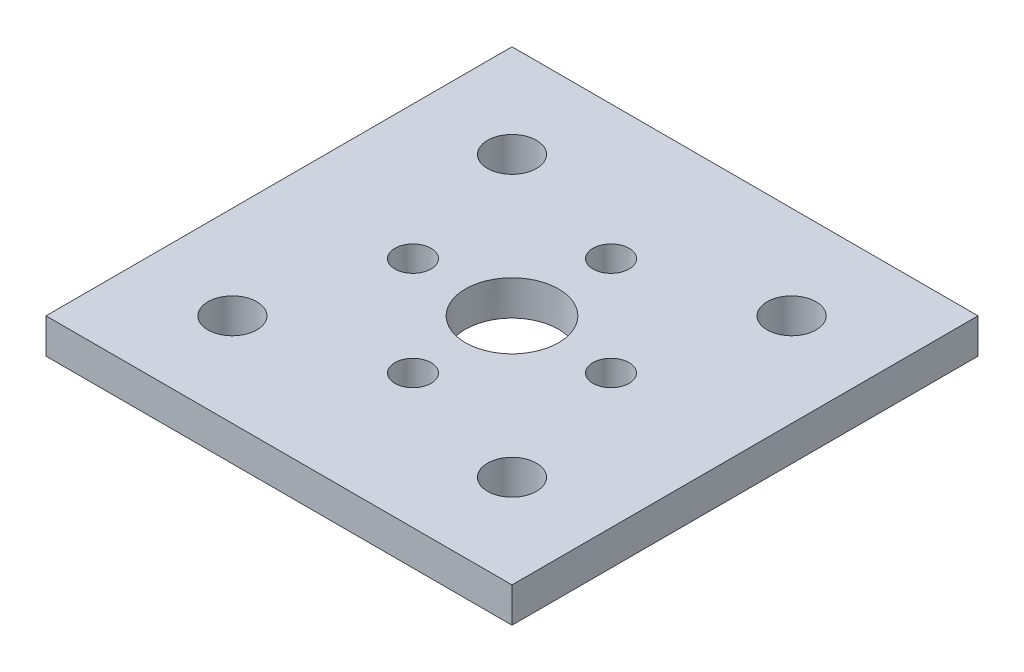
ISO-10303-21;
HEADER;
FILE_DESCRIPTION(('STEP AP214'),'2;1');
FILE_NAME('part.step','',(''),(''),'','','');
FILE_SCHEMA(('AUTOMOTIVE_DESIGN { 1 0 10303 214 1 1 1 1 }'));
ENDSEC;
DATA;
#1=APPLICATION_CONTEXT('core data for automotive mechanical design processes');
#2=APPLICATION_PROTOCOL_DEFINITION('international standard','automotive_design',2000,#1);
#3=PRODUCT_CONTEXT('',#1,'mechanical');
#4=PRODUCT('Part','Part','',(#3));
#5=PRODUCT_RELATED_PRODUCT_CATEGORY('part','',(#4));
#6=PRODUCT_DEFINITION_FORMATION('','',#4);
#7=PRODUCT_DEFINITION_CONTEXT('part definition',#1,'design');
#8=PRODUCT_DEFINITION('design','',#6,#7);
#9=PRODUCT_DEFINITION_SHAPE('','',#8);
#10=(LENGTH_UNIT() NAMED_UNIT(*) SI_UNIT(.MILLI.,.METRE.));
#11=(NAMED_UNIT(*) PLANE_ANGLE_UNIT() SI_UNIT($,.RADIAN.));
#12=(NAMED_UNIT(*) SI_UNIT($,.STERADIAN.) SOLID_ANGLE_UNIT());
#13=UNCERTAINTY_MEASURE_WITH_UNIT(LENGTH_MEASURE(1.E-05),#10,'distance_accuracy_value','');
#14=(GEOMETRIC_REPRESENTATION_CONTEXT(3) GLOBAL_UNCERTAINTY_ASSIGNED_CONTEXT((#13)) GLOBAL_UNIT_ASSIGNED_CONTEXT((#10,
#11,#12)) REPRESENTATION_CONTEXT('',''));
#15=CARTESIAN_POINT('',(0.,0.,0.));
#16=DIRECTION('',(0.,0.,1.));
#17=DIRECTION('',(1.,0.,0.));
#18=AXIS2_PLACEMENT_3D('',#15,#16,#17);
#19=CARTESIAN_POINT('',(-20.,-3.,-20.));
#20=DIRECTION('',(0.,0.,1.));
#21=DIRECTION('',(1.,0.,0.));
#22=AXIS2_PLACEMENT_3D('',#19,#20,#21);
#23=PLANE('',#22);
#24=DIRECTION('',(0.,1.,0.));
#25=VECTOR('',#24,1.);
#26=CARTESIAN_POINT('',(-20.,-3.,-20.));
#27=LINE('',#26,#25);
#28=CARTESIAN_POINT('',(-20.,-3.,-20.));
#29=VERTEX_POINT('',#28);
#30=CARTESIAN_POINT('',(-20.,0.,-20.));
#31=VERTEX_POINT('',#30);
#32=EDGE_CURVE('E133',#29,#31,#27,.T.);
#33=ORIENTED_EDGE('',*,*,#32,.T.);
#34=DIRECTION('',(-1.,0.,0.));
#35=VECTOR('',#34,1.);
#36=CARTESIAN_POINT('',(-20.,0.,-20.));
#37=LINE('',#36,#35);
#38=CARTESIAN_POINT('',(20.,0.,-20.));
#39=VERTEX_POINT('',#38);
#40=EDGE_CURVE('E126',#39,#31,#37,.T.);
#41=ORIENTED_EDGE('',*,*,#40,.F.);
#42=DIRECTION('',(0.,1.,0.));
#43=VECTOR('',#42,1.);
#44=CARTESIAN_POINT('',(20.,-3.,-20.));
#45=LINE('',#44,#43);
#46=CARTESIAN_POINT('',(20.,-3.,-20.));
#47=VERTEX_POINT('',#46);
#48=EDGE_CURVE('E12',#47,#39,#45,.T.);
#49=ORIENTED_EDGE('',*,*,#48,.F.);
#50=DIRECTION('',(1.,0.,0.));
#51=VECTOR('',#50,1.);
#52=CARTESIAN_POINT('',(-20.,-3.,-20.));
#53=LINE('',#52,#51);
#54=EDGE_CURVE('E187',#29,#47,#53,.T.);
#55=ORIENTED_EDGE('',*,*,#54,.F.);
#56=EDGE_LOOP('',(#33,#41,#49,#55));
#57=FACE_BOUND('',#56,.T.);
#58=ADVANCED_FACE('F111',(#57),#23,.F.);
#59=CARTESIAN_POINT('',(-20.,-3.,20.));
#60=DIRECTION('',(0.,0.,1.));
#61=DIRECTION('',(1.,0.,0.));
#62=AXIS2_PLACEMENT_3D('',#59,#60,#61);
#63=PLANE('',#62);
#64=DIRECTION('',(1.,0.,0.));
#65=VECTOR('',#64,1.);
#66=CARTESIAN_POINT('',(-20.,0.,20.));
#67=LINE('',#66,#65);
#68=CARTESIAN_POINT('',(-20.,0.,20.));
#69=VERTEX_POINT('',#68);
#70=CARTESIAN_POINT('',(20.,0.,20.));
#71=VERTEX_POINT('',#70);
#72=EDGE_CURVE('E154',#69,#71,#67,.T.);
#73=ORIENTED_EDGE('',*,*,#72,.F.);
#74=DIRECTION('',(0.,1.,0.));
#75=VECTOR('',#74,1.);
#76=CARTESIAN_POINT('',(-20.,-3.,20.));
#77=LINE('',#76,#75);
#78=CARTESIAN_POINT('',(-20.,-3.,20.));
#79=VERTEX_POINT('',#78);
#80=EDGE_CURVE('E164',#79,#69,#77,.T.);
#81=ORIENTED_EDGE('',*,*,#80,.F.);
#82=DIRECTION('',(1.,0.,0.));
#83=VECTOR('',#82,1.);
#84=CARTESIAN_POINT('',(-20.,-3.,20.));
#85=LINE('',#84,#83);
#86=CARTESIAN_POINT('',(20.,-3.,20.));
#87=VERTEX_POINT('',#86);
#88=EDGE_CURVE('E181',#79,#87,#85,.T.);
#89=ORIENTED_EDGE('',*,*,#88,.T.);
#90=DIRECTION('',(0.,1.,0.));
#91=VECTOR('',#90,1.);
#92=CARTESIAN_POINT('',(20.,-3.,20.));
#93=LINE('',#92,#91);
#94=EDGE_CURVE('E119',#87,#71,#93,.T.);
#95=ORIENTED_EDGE('',*,*,#94,.T.);
#96=EDGE_LOOP('',(#73,#81,#89,#95));
#97=FACE_BOUND('',#96,.T.);
#98=ADVANCED_FACE('F162',(#97),#63,.T.);
#99=CARTESIAN_POINT('',(20.,-3.,-20.));
#100=DIRECTION('',(-1.,0.,0.));
#101=DIRECTION('',(0.,0.,1.));
#102=AXIS2_PLACEMENT_3D('',#99,#100,#101);
#103=PLANE('',#102);
#104=ORIENTED_EDGE('',*,*,#48,.T.);
#105=DIRECTION('',(0.,0.,-1.));
#106=VECTOR('',#105,1.);
#107=CARTESIAN_POINT('',(20.,0.,20.));
#108=LINE('',#107,#106);
#109=EDGE_CURVE('E168',#71,#39,#108,.T.);
#110=ORIENTED_EDGE('',*,*,#109,.F.);
#111=ORIENTED_EDGE('',*,*,#94,.F.);
#112=DIRECTION('',(0.,0.,1.));
#113=VECTOR('',#112,1.);
#114=CARTESIAN_POINT('',(20.,-3.,-20.));
#115=LINE('',#114,#113);
#116=EDGE_CURVE('E184',#47,#87,#115,.T.);
#117=ORIENTED_EDGE('',*,*,#116,.F.);
#118=EDGE_LOOP('',(#104,#110,#111,#117));
#119=FACE_BOUND('',#118,.T.);
#120=ADVANCED_FACE('F295',(#119),#103,.F.);
#121=CARTESIAN_POINT('',(-20.,-3.,-20.));
#122=DIRECTION('',(-1.,0.,0.));
#123=DIRECTION('',(0.,0.,1.));
#124=AXIS2_PLACEMENT_3D('',#121,#122,#123);
#125=PLANE('',#124);
#126=DIRECTION('',(0.,0.,1.));
#127=VECTOR('',#126,1.);
#128=CARTESIAN_POINT('',(-20.,0.,20.));
#129=LINE('',#128,#127);
#130=EDGE_CURVE('E150',#31,#69,#129,.T.);
#131=ORIENTED_EDGE('',*,*,#130,.F.);
#132=ORIENTED_EDGE('',*,*,#32,.F.);
#133=DIRECTION('',(0.,0.,1.));
#134=VECTOR('',#133,1.);
#135=CARTESIAN_POINT('',(-20.,-3.,-20.));
#136=LINE('',#135,#134);
#137=EDGE_CURVE('E172',#29,#79,#136,.T.);
#138=ORIENTED_EDGE('',*,*,#137,.T.);
#139=ORIENTED_EDGE('',*,*,#80,.T.);
#140=EDGE_LOOP('',(#131,#132,#138,#139));
#141=FACE_BOUND('',#140,.T.);
#142=ADVANCED_FACE('F170',(#141),#125,.T.);
#143=CARTESIAN_POINT('',(0.,0.,0.));
#144=DIRECTION('',(0.,-1.,0.));
#145=DIRECTION('',(0.,0.,-1.));
#146=AXIS2_PLACEMENT_3D('',#143,#144,#145);
#147=PLANE('',#146);
#148=CARTESIAN_POINT('',(-8.5,0.,0.));
#149=DIRECTION('',(0.,1.,0.));
#150=DIRECTION('',(0.,0.,1.));
#151=AXIS2_PLACEMENT_3D('',#148,#149,#150);
#152=CIRCLE('',#151,1.55);
#153=CARTESIAN_POINT('',(-8.5,0.,1.54999999999991));
#154=VERTEX_POINT('',#153);
#155=EDGE_CURVE('E192',#154,#154,#152,.T.);
#156=ORIENTED_EDGE('',*,*,#155,.F.);
#157=EDGE_LOOP('',(#156));
#158=FACE_BOUND('',#157,.T.);
#159=CARTESIAN_POINT('',(0.,0.,8.5));
#160=DIRECTION('',(0.,1.,0.));
#161=DIRECTION('',(0.,0.,1.));
#162=AXIS2_PLACEMENT_3D('',#159,#160,#161);
#163=CIRCLE('',#162,1.55);
#164=CARTESIAN_POINT('',(0.,0.,10.05));
#165=VERTEX_POINT('',#164);
#166=EDGE_CURVE('E200',#165,#165,#163,.T.);
#167=ORIENTED_EDGE('',*,*,#166,.F.);
#168=EDGE_LOOP('',(#167));
#169=FACE_BOUND('',#168,.T.);
#170=CARTESIAN_POINT('',(0.,0.,-8.5));
#171=DIRECTION('',(0.,1.,0.));
#172=DIRECTION('',(0.,0.,1.));
#173=AXIS2_PLACEMENT_3D('',#170,#171,#172);
#174=CIRCLE('',#173,1.55);
#175=CARTESIAN_POINT('',(0.,0.,-6.95));
#176=VERTEX_POINT('',#175);
#177=EDGE_CURVE('E208',#176,#176,#174,.T.);
#178=ORIENTED_EDGE('',*,*,#177,.F.);
#179=EDGE_LOOP('',(#178));
#180=FACE_BOUND('',#179,.T.);
#181=CARTESIAN_POINT('',(8.5,0.,0.));
#182=DIRECTION('',(0.,1.,0.));
#183=DIRECTION('',(0.,0.,1.));
#184=AXIS2_PLACEMENT_3D('',#181,#182,#183);
#185=CIRCLE('',#184,1.55);
#186=CARTESIAN_POINT('',(8.5,0.,1.55000000000003));
#187=VERTEX_POINT('',#186);
#188=EDGE_CURVE('E216',#187,#187,#185,.T.);
#189=ORIENTED_EDGE('',*,*,#188,.F.);
#190=EDGE_LOOP('',(#189));
#191=FACE_BOUND('',#190,.T.);
#192=CARTESIAN_POINT('',(0.,0.,0.));
#193=DIRECTION('',(0.,1.,0.));
#194=DIRECTION('',(0.,0.,1.));
#195=AXIS2_PLACEMENT_3D('',#192,#193,#194);
#196=CIRCLE('',#195,4.);
#197=CARTESIAN_POINT('',(0.,0.,4.));
#198=VERTEX_POINT('',#197);
#199=EDGE_CURVE('E220',#198,#198,#196,.T.);
#200=ORIENTED_EDGE('',*,*,#199,.F.);
#201=EDGE_LOOP('',(#200));
#202=FACE_BOUND('',#201,.T.);
#203=ORIENTED_EDGE('',*,*,#130,.T.);
#204=ORIENTED_EDGE('',*,*,#72,.T.);
#205=ORIENTED_EDGE('',*,*,#109,.T.);
#206=ORIENTED_EDGE('',*,*,#40,.T.);
#207=EDGE_LOOP('',(#203,#204,#205,#206));
#208=FACE_BOUND('',#207,.T.);
#209=CARTESIAN_POINT('',(-12.0000000000001,0.,-11.9999999999999));
#210=DIRECTION('',(0.,1.,0.));
#211=DIRECTION('',(0.,0.,1.));
#212=AXIS2_PLACEMENT_3D('',#209,#210,#211);
#213=CIRCLE('',#212,2.1);
#214=CARTESIAN_POINT('',(-12.0000000000001,0.,-9.89999999999988));
#215=VERTEX_POINT('',#214);
#216=EDGE_CURVE('E235',#215,#215,#213,.T.);
#217=ORIENTED_EDGE('',*,*,#216,.F.);
#218=EDGE_LOOP('',(#217));
#219=FACE_BOUND('',#218,.T.);
#220=CARTESIAN_POINT('',(11.9999999999999,0.,-12.0000000000001));
#221=DIRECTION('',(0.,1.,0.));
#222=DIRECTION('',(0.,0.,1.));
#223=AXIS2_PLACEMENT_3D('',#220,#221,#222);
#224=CIRCLE('',#223,2.1);
#225=CARTESIAN_POINT('',(11.9999999999999,0.,-9.90000000000009));
#226=VERTEX_POINT('',#225);
#227=EDGE_CURVE('E239',#226,#226,#224,.T.);
#228=ORIENTED_EDGE('',*,*,#227,.F.);
#229=EDGE_LOOP('',(#228));
#230=FACE_BOUND('',#229,.T.);
#231=CARTESIAN_POINT('',(12.,0.,12.));
#232=DIRECTION('',(0.,1.,0.));
#233=DIRECTION('',(0.,0.,1.));
#234=AXIS2_PLACEMENT_3D('',#231,#232,#233);
#235=CIRCLE('',#234,2.1);
#236=CARTESIAN_POINT('',(12.,0.,14.1));
#237=VERTEX_POINT('',#236);
#238=EDGE_CURVE('E248',#237,#237,#235,.T.);
#239=ORIENTED_EDGE('',*,*,#238,.F.);
#240=EDGE_LOOP('',(#239));
#241=FACE_BOUND('',#240,.T.);
#242=CARTESIAN_POINT('',(-12.,0.,12.));
#243=DIRECTION('',(0.,1.,0.));
#244=DIRECTION('',(0.,0.,1.));
#245=AXIS2_PLACEMENT_3D('',#242,#243,#244);
#246=CIRCLE('',#245,2.1);
#247=CARTESIAN_POINT('',(-12.,0.,14.1));
#248=VERTEX_POINT('',#247);
#249=EDGE_CURVE('E247',#248,#248,#246,.T.);
#250=ORIENTED_EDGE('',*,*,#249,.F.);
#251=EDGE_LOOP('',(#250));
#252=FACE_BOUND('',#251,.T.);
#253=ADVANCED_FACE('F152',(#158,#169,#180,#191,#202,#208,#219,#230,#241,#252),#147,.F.);
#254=CARTESIAN_POINT('',(0.,-3.,0.));
#255=DIRECTION('',(0.,-1.,0.));
#256=DIRECTION('',(0.,0.,-1.));
#257=AXIS2_PLACEMENT_3D('',#254,#255,#256);
#258=PLANE('',#257);
#259=CARTESIAN_POINT('',(0.,-3.,0.));
#260=DIRECTION('',(0.,-1.,0.));
#261=DIRECTION('',(0.,0.,-1.));
#262=AXIS2_PLACEMENT_3D('',#259,#260,#261);
#263=CIRCLE('',#262,4.);
#264=CARTESIAN_POINT('',(0.,-3.,-4.));
#265=VERTEX_POINT('',#264);
#266=EDGE_CURVE('E227',#265,#265,#263,.T.);
#267=ORIENTED_EDGE('',*,*,#266,.F.);
#268=EDGE_LOOP('',(#267));
#269=FACE_BOUND('',#268,.T.);
#270=CARTESIAN_POINT('',(8.5,-3.,0.));
#271=DIRECTION('',(0.,1.,0.));
#272=DIRECTION('',(0.,0.,1.));
#273=AXIS2_PLACEMENT_3D('',#270,#271,#272);
#274=CIRCLE('',#273,1.55);
#275=CARTESIAN_POINT('',(8.5,-3.,1.55000000000003));
#276=VERTEX_POINT('',#275);
#277=EDGE_CURVE('E212',#276,#276,#274,.T.);
#278=ORIENTED_EDGE('',*,*,#277,.T.);
#279=EDGE_LOOP('',(#278));
#280=FACE_BOUND('',#279,.T.);
#281=CARTESIAN_POINT('',(0.,-3.,-8.5));
#282=DIRECTION('',(0.,1.,0.));
#283=DIRECTION('',(0.,0.,1.));
#284=AXIS2_PLACEMENT_3D('',#281,#282,#283);
#285=CIRCLE('',#284,1.55);
#286=CARTESIAN_POINT('',(0.,-3.,-6.95));
#287=VERTEX_POINT('',#286);
#288=EDGE_CURVE('E204',#287,#287,#285,.T.);
#289=ORIENTED_EDGE('',*,*,#288,.T.);
#290=EDGE_LOOP('',(#289));
#291=FACE_BOUND('',#290,.T.);
#292=CARTESIAN_POINT('',(0.,-3.,8.5));
#293=DIRECTION('',(0.,1.,0.));
#294=DIRECTION('',(0.,0.,1.));
#295=AXIS2_PLACEMENT_3D('',#292,#293,#294);
#296=CIRCLE('',#295,1.55);
#297=CARTESIAN_POINT('',(0.,-3.,10.05));
#298=VERTEX_POINT('',#297);
#299=EDGE_CURVE('E196',#298,#298,#296,.T.);
#300=ORIENTED_EDGE('',*,*,#299,.T.);
#301=EDGE_LOOP('',(#300));
#302=FACE_BOUND('',#301,.T.);
#303=CARTESIAN_POINT('',(-8.5,-3.,0.));
#304=DIRECTION('',(0.,1.,0.));
#305=DIRECTION('',(0.,0.,1.));
#306=AXIS2_PLACEMENT_3D('',#303,#304,#305);
#307=CIRCLE('',#306,1.55);
#308=CARTESIAN_POINT('',(-8.5,-3.,1.54999999999991));
#309=VERTEX_POINT('',#308);
#310=EDGE_CURVE('E191',#309,#309,#307,.T.);
#311=ORIENTED_EDGE('',*,*,#310,.T.);
#312=EDGE_LOOP('',(#311));
#313=FACE_BOUND('',#312,.T.);
#314=ORIENTED_EDGE('',*,*,#54,.T.);
#315=ORIENTED_EDGE('',*,*,#116,.T.);
#316=ORIENTED_EDGE('',*,*,#88,.F.);
#317=ORIENTED_EDGE('',*,*,#137,.F.);
#318=EDGE_LOOP('',(#314,#315,#316,#317));
#319=FACE_BOUND('',#318,.T.);
#320=CARTESIAN_POINT('',(-12.0000000000001,-3.,-11.9999999999999));
#321=DIRECTION('',(0.,1.,0.));
#322=DIRECTION('',(0.,0.,1.));
#323=AXIS2_PLACEMENT_3D('',#320,#321,#322);
#324=CIRCLE('',#323,2.1);
#325=CARTESIAN_POINT('',(-12.0000000000001,-3.,-9.89999999999988));
#326=VERTEX_POINT('',#325);
#327=EDGE_CURVE('E158',#326,#326,#324,.T.);
#328=ORIENTED_EDGE('',*,*,#327,.T.);
#329=EDGE_LOOP('',(#328));
#330=FACE_BOUND('',#329,.T.);
#331=CARTESIAN_POINT('',(11.9999999999999,-3.,-12.0000000000001));
#332=DIRECTION('',(0.,1.,0.));
#333=DIRECTION('',(0.,0.,1.));
#334=AXIS2_PLACEMENT_3D('',#331,#332,#333);
#335=CIRCLE('',#334,2.1);
#336=CARTESIAN_POINT('',(11.9999999999999,-3.,-9.90000000000009));
#337=VERTEX_POINT('',#336);
#338=EDGE_CURVE('E252',#337,#337,#335,.T.);
#339=ORIENTED_EDGE('',*,*,#338,.T.);
#340=EDGE_LOOP('',(#339));
#341=FACE_BOUND('',#340,.T.);
#342=CARTESIAN_POINT('',(12.,-3.,12.));
#343=DIRECTION('',(0.,1.,0.));
#344=DIRECTION('',(0.,0.,1.));
#345=AXIS2_PLACEMENT_3D('',#342,#343,#344);
#346=CIRCLE('',#345,2.1);
#347=CARTESIAN_POINT('',(12.,-3.,14.1));
#348=VERTEX_POINT('',#347);
#349=EDGE_CURVE('E259',#348,#348,#346,.T.);
#350=ORIENTED_EDGE('',*,*,#349,.T.);
#351=EDGE_LOOP('',(#350));
#352=FACE_BOUND('',#351,.T.);
#353=CARTESIAN_POINT('',(-12.,-3.,12.));
#354=DIRECTION('',(0.,1.,0.));
#355=DIRECTION('',(0.,0.,1.));
#356=AXIS2_PLACEMENT_3D('',#353,#354,#355);
#357=CIRCLE('',#356,2.1);
#358=CARTESIAN_POINT('',(-12.,-3.,14.1));
#359=VERTEX_POINT('',#358);
#360=EDGE_CURVE('E243',#359,#359,#357,.T.);
#361=ORIENTED_EDGE('',*,*,#360,.T.);
#362=EDGE_LOOP('',(#361));
#363=FACE_BOUND('',#362,.T.);
#364=ADVANCED_FACE('F271',(#269,#280,#291,#302,#313,#319,#330,#341,#352,#363),#258,.T.);
#365=CARTESIAN_POINT('',(-8.5,-3.,0.));
#366=DIRECTION('',(0.,1.,0.));
#367=DIRECTION('',(0.,0.,1.));
#368=AXIS2_PLACEMENT_3D('',#365,#366,#367);
#369=CYLINDRICAL_SURFACE('',#368,1.55);
#370=ORIENTED_EDGE('',*,*,#310,.F.);
#371=EDGE_LOOP('',(#370));
#372=FACE_BOUND('',#371,.T.);
#373=ORIENTED_EDGE('',*,*,#155,.T.);
#374=EDGE_LOOP('',(#373));
#375=FACE_BOUND('',#374,.T.);
#376=ADVANCED_FACE('F309',(#372,#375),#369,.F.);
#377=CARTESIAN_POINT('',(0.,-3.,8.5));
#378=DIRECTION('',(0.,1.,0.));
#379=DIRECTION('',(0.,0.,1.));
#380=AXIS2_PLACEMENT_3D('',#377,#378,#379);
#381=CYLINDRICAL_SURFACE('',#380,1.55);
#382=ORIENTED_EDGE('',*,*,#299,.F.);
#383=EDGE_LOOP('',(#382));
#384=FACE_BOUND('',#383,.T.);
#385=ORIENTED_EDGE('',*,*,#166,.T.);
#386=EDGE_LOOP('',(#385));
#387=FACE_BOUND('',#386,.T.);
#388=ADVANCED_FACE('F313',(#384,#387),#381,.F.);
#389=CARTESIAN_POINT('',(0.,-3.,-8.5));
#390=DIRECTION('',(0.,1.,0.));
#391=DIRECTION('',(0.,0.,1.));
#392=AXIS2_PLACEMENT_3D('',#389,#390,#391);
#393=CYLINDRICAL_SURFACE('',#392,1.55);
#394=ORIENTED_EDGE('',*,*,#288,.F.);
#395=EDGE_LOOP('',(#394));
#396=FACE_BOUND('',#395,.T.);
#397=ORIENTED_EDGE('',*,*,#177,.T.);
#398=EDGE_LOOP('',(#397));
#399=FACE_BOUND('',#398,.T.);
#400=ADVANCED_FACE('F317',(#396,#399),#393,.F.);
#401=CARTESIAN_POINT('',(8.5,-3.,0.));
#402=DIRECTION('',(0.,1.,0.));
#403=DIRECTION('',(0.,0.,1.));
#404=AXIS2_PLACEMENT_3D('',#401,#402,#403);
#405=CYLINDRICAL_SURFACE('',#404,1.55);
#406=ORIENTED_EDGE('',*,*,#277,.F.);
#407=EDGE_LOOP('',(#406));
#408=FACE_BOUND('',#407,.T.);
#409=ORIENTED_EDGE('',*,*,#188,.T.);
#410=EDGE_LOOP('',(#409));
#411=FACE_BOUND('',#410,.T.);
#412=ADVANCED_FACE('F321',(#408,#411),#405,.F.);
#413=CARTESIAN_POINT('',(0.,-1.5,0.));
#414=DIRECTION('',(0.,1.,0.));
#415=DIRECTION('',(0.,0.,1.));
#416=AXIS2_PLACEMENT_3D('',#413,#414,#415);
#417=CYLINDRICAL_SURFACE('',#416,4.);
#418=ORIENTED_EDGE('',*,*,#199,.T.);
#419=EDGE_LOOP('',(#418));
#420=FACE_BOUND('',#419,.T.);
#421=ORIENTED_EDGE('',*,*,#266,.T.);
#422=EDGE_LOOP('',(#421));
#423=FACE_BOUND('',#422,.T.);
#424=ADVANCED_FACE('F325',(#420,#423),#417,.F.);
#425=CARTESIAN_POINT('',(-12.0000000000001,-3.,-11.9999999999999));
#426=DIRECTION('',(0.,1.,0.));
#427=DIRECTION('',(0.,0.,1.));
#428=AXIS2_PLACEMENT_3D('',#425,#426,#427);
#429=CYLINDRICAL_SURFACE('',#428,2.1);
#430=ORIENTED_EDGE('',*,*,#327,.F.);
#431=EDGE_LOOP('',(#430));
#432=FACE_BOUND('',#431,.T.);
#433=ORIENTED_EDGE('',*,*,#216,.T.);
#434=EDGE_LOOP('',(#433));
#435=FACE_BOUND('',#434,.T.);
#436=ADVANCED_FACE('F327',(#432,#435),#429,.F.);
#437=CARTESIAN_POINT('',(11.9999999999999,-3.,-12.0000000000001));
#438=DIRECTION('',(0.,1.,0.));
#439=DIRECTION('',(0.,0.,1.));
#440=AXIS2_PLACEMENT_3D('',#437,#438,#439);
#441=CYLINDRICAL_SURFACE('',#440,2.1);
#442=ORIENTED_EDGE('',*,*,#338,.F.);
#443=EDGE_LOOP('',(#442));
#444=FACE_BOUND('',#443,.T.);
#445=ORIENTED_EDGE('',*,*,#227,.T.);
#446=EDGE_LOOP('',(#445));
#447=FACE_BOUND('',#446,.T.);
#448=ADVANCED_FACE('F283',(#444,#447),#441,.F.);
#449=CARTESIAN_POINT('',(12.,-3.,12.));
#450=DIRECTION('',(0.,1.,0.));
#451=DIRECTION('',(0.,0.,1.));
#452=AXIS2_PLACEMENT_3D('',#449,#450,#451);
#453=CYLINDRICAL_SURFACE('',#452,2.1);
#454=ORIENTED_EDGE('',*,*,#349,.F.);
#455=EDGE_LOOP('',(#454));
#456=FACE_BOUND('',#455,.T.);
#457=ORIENTED_EDGE('',*,*,#238,.T.);
#458=EDGE_LOOP('',(#457));
#459=FACE_BOUND('',#458,.T.);
#460=ADVANCED_FACE('F267',(#456,#459),#453,.F.);
#461=CARTESIAN_POINT('',(-12.,-3.,12.));
#462=DIRECTION('',(0.,1.,0.));
#463=DIRECTION('',(0.,0.,1.));
#464=AXIS2_PLACEMENT_3D('',#461,#462,#463);
#465=CYLINDRICAL_SURFACE('',#464,2.1);
#466=ORIENTED_EDGE('',*,*,#360,.F.);
#467=EDGE_LOOP('',(#466));
#468=FACE_BOUND('',#467,.T.);
#469=ORIENTED_EDGE('',*,*,#249,.T.);
#470=EDGE_LOOP('',(#469));
#471=FACE_BOUND('',#470,.T.);
#472=ADVANCED_FACE('F276',(#468,#471),#465,.F.);
#473=CLOSED_SHELL('',(#58,#98,#120,#142,#253,#364,#376,#388,#400,#412,#424,#436,#448,#460,#472));
#474=MANIFOLD_SOLID_BREP('B2',#473);
#475=ADVANCED_BREP_SHAPE_REPRESENTATION('',(#18,#474),#14);
#476=SHAPE_DEFINITION_REPRESENTATION(#9,#475);
ENDSEC;
END-ISO-10303-21;
